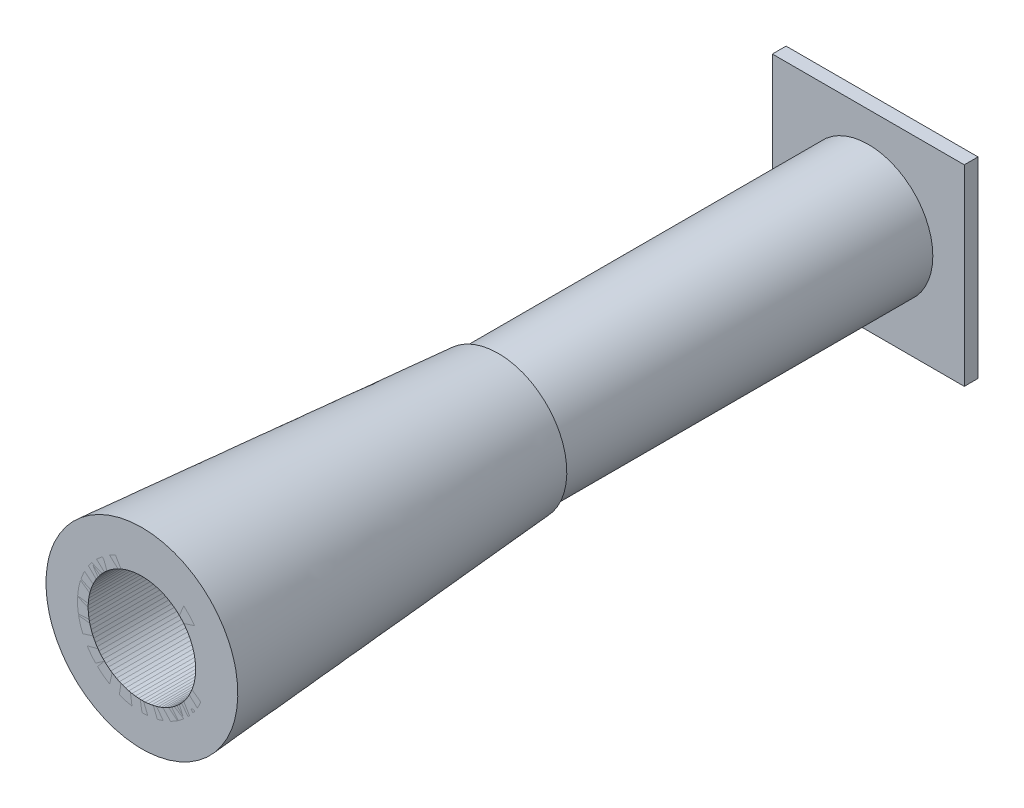
ISO-10303-21;
HEADER;
FILE_DESCRIPTION(('STEP AP214'),'2;1');
FILE_NAME('part.step','',(''),(''),'','','');
FILE_SCHEMA(('AUTOMOTIVE_DESIGN { 1 0 10303 214 1 1 1 1 }'));
ENDSEC;
DATA;
#1=APPLICATION_CONTEXT('core data for automotive mechanical design processes');
#2=APPLICATION_PROTOCOL_DEFINITION('international standard','automotive_design',2000,#1);
#3=PRODUCT_CONTEXT('',#1,'mechanical');
#4=PRODUCT('Part','Part','',(#3));
#5=PRODUCT_RELATED_PRODUCT_CATEGORY('part','',(#4));
#6=PRODUCT_DEFINITION_FORMATION('','',#4);
#7=PRODUCT_DEFINITION_CONTEXT('part definition',#1,'design');
#8=PRODUCT_DEFINITION('design','',#6,#7);
#9=PRODUCT_DEFINITION_SHAPE('','',#8);
#10=(LENGTH_UNIT() NAMED_UNIT(*) SI_UNIT(.MILLI.,.METRE.));
#11=(NAMED_UNIT(*) PLANE_ANGLE_UNIT() SI_UNIT($,.RADIAN.));
#12=(NAMED_UNIT(*) SI_UNIT($,.STERADIAN.) SOLID_ANGLE_UNIT());
#13=UNCERTAINTY_MEASURE_WITH_UNIT(LENGTH_MEASURE(1.E-05),#10,'distance_accuracy_value','');
#14=(GEOMETRIC_REPRESENTATION_CONTEXT(3) GLOBAL_UNCERTAINTY_ASSIGNED_CONTEXT((#13)) GLOBAL_UNIT_ASSIGNED_CONTEXT((#10,
#11,#12)) REPRESENTATION_CONTEXT('',''));
#15=CARTESIAN_POINT('',(0.,0.,0.));
#16=DIRECTION('',(0.,0.,1.));
#17=DIRECTION('',(1.,0.,0.));
#18=AXIS2_PLACEMENT_3D('',#15,#16,#17);
#19=CARTESIAN_POINT('',(0.,0.,6.604));
#20=DIRECTION('',(0.,0.,1.));
#21=DIRECTION('',(1.,0.,0.));
#22=AXIS2_PLACEMENT_3D('',#19,#20,#21);
#23=PLANE('',#22);
#24=CARTESIAN_POINT('',(0.,0.,6.604));
#25=DIRECTION('',(0.,0.,1.));
#26=DIRECTION('',(1.,0.,0.));
#27=AXIS2_PLACEMENT_3D('',#24,#25,#26);
#28=CIRCLE('',#27,0.99695);
#29=CARTESIAN_POINT('',(0.99695,0.,6.604));
#30=VERTEX_POINT('',#29);
#31=EDGE_CURVE('E150',#30,#30,#28,.T.);
#32=ORIENTED_EDGE('',*,*,#31,.F.);
#33=EDGE_LOOP('',(#32));
#34=FACE_BOUND('',#33,.T.);
#35=CARTESIAN_POINT('',(0.,0.,6.604));
#36=DIRECTION('',(0.,0.,1.));
#37=DIRECTION('',(1.,0.,0.));
#38=AXIS2_PLACEMENT_3D('',#35,#36,#37);
#39=CIRCLE('',#38,1.77744711569565);
#40=CARTESIAN_POINT('',(0.,1.77744711569565,6.604));
#41=VERTEX_POINT('',#40);
#42=EDGE_CURVE('E13',#41,#41,#39,.T.);
#43=ORIENTED_EDGE('',*,*,#42,.T.);
#44=EDGE_LOOP('',(#43));
#45=FACE_BOUND('',#44,.T.);
#46=ADVANCED_FACE('F75',(#34,#45),#23,.T.);
#47=CARTESIAN_POINT('',(0.,0.,0.));
#48=DIRECTION('',(0.,0.,1.));
#49=DIRECTION('',(1.,0.,0.));
#50=AXIS2_PLACEMENT_3D('',#47,#48,#49);
#51=PLANE('',#50);
#52=CARTESIAN_POINT('',(0.,0.,0.));
#53=DIRECTION('',(0.,0.,1.));
#54=DIRECTION('',(1.,0.,0.));
#55=AXIS2_PLACEMENT_3D('',#52,#53,#54);
#56=CIRCLE('',#55,1.27);
#57=CARTESIAN_POINT('',(-1.26997479373003E-11,1.27,0.));
#58=VERTEX_POINT('',#57);
#59=EDGE_CURVE('E83',#58,#58,#56,.T.);
#60=ORIENTED_EDGE('',*,*,#59,.F.);
#61=EDGE_LOOP('',(#60));
#62=FACE_BOUND('',#61,.T.);
#63=ADVANCED_FACE('F107',(#62),#51,.F.);
#64=CARTESIAN_POINT('',(-1.26997479373003E-11,1.27,0.));
#65=CARTESIAN_POINT('',(-8.46638568714059E-12,1.43914903856522,2.20133333333333));
#66=CARTESIAN_POINT('',(-4.23303021324442E-12,1.60829807713043,4.40266666666667));
#67=CARTESIAN_POINT('',(0.,1.77744711569565,6.604));
#68=CARTESIAN_POINT('',(-0.0350466031428165,1.26999999999965,0.));
#69=CARTESIAN_POINT('',(-0.0397143978034933,1.43914903856498,2.20133333333333));
#70=CARTESIAN_POINT('',(-0.0443821924641701,1.60829807713031,4.40266666666667));
#71=CARTESIAN_POINT('',(-0.0490499871248469,1.77744711569565,6.604));
#72=CARTESIAN_POINT('',(-0.104480488776998,1.26715466031197,0.));
#73=CARTESIAN_POINT('',(-0.118396059027349,1.4359247331512,2.20133333333333));
#74=CARTESIAN_POINT('',(-0.1323116292777,1.60469480599042,4.40266666666667));
#75=CARTESIAN_POINT('',(-0.14622719952805,1.77346487882965,6.604));
#76=CARTESIAN_POINT('',(-0.206325452490974,1.25467853457865,0.));
#77=CARTESIAN_POINT('',(-0.233805572107468,1.42178693444763,2.20133333333333));
#78=CARTESIAN_POINT('',(-0.261285691723963,1.58889533431662,4.40266666666667));
#79=CARTESIAN_POINT('',(-0.288765811340457,1.75600373418561,6.604));
#80=CARTESIAN_POINT('',(-0.305536648608512,1.23432219550268,0.));
#81=CARTESIAN_POINT('',(-0.346230530774854,1.39871937081826,2.20133333333333));
#82=CARTESIAN_POINT('',(-0.386924412941197,1.56311654613385,4.40266666666667));
#83=CARTESIAN_POINT('',(-0.427618295107539,1.72751372144943,6.604));
#84=CARTESIAN_POINT('',(-0.883033802580258,1.06687029814585,0.));
#85=CARTESIAN_POINT('',(-1.00064350236035,1.20896485342962,2.20133333333333));
#86=CARTESIAN_POINT('',(-1.11825320214044,1.35105940871339,4.40266666666667));
#87=CARTESIAN_POINT('',(-1.23586290192053,1.49315396399715,6.604));
#88=CARTESIAN_POINT('',(-1.27000000000561,0.56074565006917,0.));
#89=CARTESIAN_POINT('',(-1.43914903856895,0.635430364711966,2.20133333333333));
#90=CARTESIAN_POINT('',(-1.6082980771323,0.710115079354762,4.40266666666667));
#91=CARTESIAN_POINT('',(-1.77744711569565,0.784799793997559,6.604));
#92=CARTESIAN_POINT('',(-1.26999999999299,-0.700932062615037,0.));
#93=CARTESIAN_POINT('',(-1.43914903856054,-0.794287955909007,2.20133333333333));
#94=CARTESIAN_POINT('',(-1.60829807712809,-0.887643849202978,4.40266666666667));
#95=CARTESIAN_POINT('',(-1.77744711569565,-0.980999742496948,6.604));
#96=CARTESIAN_POINT('',(-0.700932062589637,-1.27000000000701,0.));
#97=CARTESIAN_POINT('',(-0.794287955892074,-1.43914903856989,2.20133333333333));
#98=CARTESIAN_POINT('',(-0.887643849194511,-1.60829807713277,4.40266666666667));
#99=CARTESIAN_POINT('',(-0.980999742496949,-1.77744711569565,6.604));
#100=CARTESIAN_POINT('',(0.700932062615037,-1.26999999999299,0.));
#101=CARTESIAN_POINT('',(0.794287955909007,-1.43914903856054,2.20133333333333));
#102=CARTESIAN_POINT('',(0.887643849202978,-1.60829807712809,4.40266666666667));
#103=CARTESIAN_POINT('',(0.980999742496948,-1.77744711569565,6.604));
#104=CARTESIAN_POINT('',(1.27000000000701,-0.700932062589637,0.));
#105=CARTESIAN_POINT('',(1.43914903856989,-0.794287955892075,2.20133333333333));
#106=CARTESIAN_POINT('',(1.60829807713277,-0.887643849194512,4.40266666666667));
#107=CARTESIAN_POINT('',(1.77744711569565,-0.980999742496949,6.604));
#108=CARTESIAN_POINT('',(1.26999999999439,0.560745650094569,0.));
#109=CARTESIAN_POINT('',(1.43914903856148,0.635430364728899,2.20133333333333));
#110=CARTESIAN_POINT('',(1.60829807712856,0.710115079363229,4.40266666666667));
#111=CARTESIAN_POINT('',(1.77744711569565,0.784799793997558,6.604));
#112=CARTESIAN_POINT('',(0.883033802558921,1.06687029816351,0.));
#113=CARTESIAN_POINT('',(1.00064350234612,1.20896485344139,2.20133333333333));
#114=CARTESIAN_POINT('',(1.11825320213333,1.35105940871927,4.40266666666667));
#115=CARTESIAN_POINT('',(1.23586290192053,1.49315396399715,6.604));
#116=CARTESIAN_POINT('',(0.305536648583826,1.23432219550879,0.));
#117=CARTESIAN_POINT('',(0.346230530758397,1.39871937082233,2.20133333333333));
#118=CARTESIAN_POINT('',(0.386924412932968,1.56311654613588,4.40266666666667));
#119=CARTESIAN_POINT('',(0.42761829510754,1.72751372144943,6.604));
#120=CARTESIAN_POINT('',(0.206325452465881,1.25467853458277,0.));
#121=CARTESIAN_POINT('',(0.23380557209074,1.42178693445038,2.20133333333333));
#122=CARTESIAN_POINT('',(0.261285691715599,1.588895334318,4.40266666666667));
#123=CARTESIAN_POINT('',(0.288765811340458,1.75600373418561,6.604));
#124=CARTESIAN_POINT('',(0.104480488751656,1.26715466031406,0.));
#125=CARTESIAN_POINT('',(0.118396059010454,1.43592473315259,2.20133333333333));
#126=CARTESIAN_POINT('',(0.132311629269253,1.60469480599112,4.40266666666667));
#127=CARTESIAN_POINT('',(0.146227199528051,1.77346487882965,6.604));
#128=CARTESIAN_POINT('',(0.035046603117417,1.27000000000035,0.));
#129=CARTESIAN_POINT('',(0.0397143977865605,1.43914903856545,2.20133333333333));
#130=CARTESIAN_POINT('',(0.0443821924557041,1.60829807713055,4.40266666666667));
#131=CARTESIAN_POINT('',(0.0490499871248476,1.77744711569565,6.604));
#132=CARTESIAN_POINT('',(-1.26997479373003E-11,1.27,0.));
#133=CARTESIAN_POINT('',(-8.46638568714059E-12,1.43914903856522,2.20133333333333));
#134=CARTESIAN_POINT('',(-4.23303021324442E-12,1.60829807713043,4.40266666666667));
#135=CARTESIAN_POINT('',(0.,1.77744711569565,6.604));
#136=B_SPLINE_SURFACE_WITH_KNOTS('',3,3,((#64,#65,#66,#67),(#68,#69,#70,#71),(#72,#73,#74,#75),
(#76,#77,#78,#79),(#80,#81,#82,#83),(#84,#85,#86,#87),(#88,#89,#90,#91),(#92,#93,#94,#95),(#96,
#97,#98,#99),(#100,#101,#102,#103),(#104,#105,#106,#107),(#108,#109,#110,#111),(#112,#113,#114,
#115),(#116,#117,#118,#119),(#120,#121,#122,#123),(#124,#125,#126,#127),(#128,#129,#130,#131),
(#132,#133,#134,#135)),.UNSPECIFIED.,.T.,.F.,.F.,(4,1,1,1,1,2,2,2,1,1,1,1,4),(4,4),(0.,0.0125,
0.0249999999999999,0.0375000000000001,0.05,0.25,0.5,0.75,0.95,0.9625,0.975,0.9875,1.),(0.,1.),.UNSPECIFIED.);
#137=CARTESIAN_POINT('',(-1.26997479373003E-11,1.27,0.));
#138=CARTESIAN_POINT('',(-1.25674553669828E-11,1.27528590745516,0.0687916666666665));
#139=CARTESIAN_POINT('',(-1.24351628032828E-11,1.28057181491033,0.137583333333333));
#140=CARTESIAN_POINT('',(-1.21705776884972E-11,1.29114362982065,0.275166666666667));
#141=CARTESIAN_POINT('',(-1.20382851374117E-11,1.29642953727581,0.343958333333333));
#142=CARTESIAN_POINT('',(-1.17737000472347E-11,1.30700135218614,0.481541666666667));
#143=CARTESIAN_POINT('',(-1.16414075081433E-11,1.3122872596413,0.550333333333333));
#144=CARTESIAN_POINT('',(-1.13768224413342E-11,1.32285907455163,0.687916666666667));
#145=CARTESIAN_POINT('',(-1.12445299136165E-11,1.32814498200679,0.756708333333333));
#146=CARTESIAN_POINT('',(-1.09799448689344E-11,1.33871679691712,0.894291666666667));
#147=CARTESIAN_POINT('',(-1.08476523519701E-11,1.34400270437228,0.963083333333333));
#148=CARTESIAN_POINT('',(-1.05830673281744E-11,1.35457451928261,1.10066666666667));
#149=CARTESIAN_POINT('',(-1.0450774821343E-11,1.35986042673777,1.16945833333333));
#150=CARTESIAN_POINT('',(-1.01861898171928E-11,1.3704322416481,1.30704166666667));
#151=CARTESIAN_POINT('',(-1.0053897319874E-11,1.37571814910326,1.37583333333333));
#152=CARTESIAN_POINT('',(-9.78931233412859E-12,1.38628996401359,1.51341666666667));
#153=CARTESIAN_POINT('',(-9.65701984570198E-12,1.39157587146875,1.58220833333333));
#154=CARTESIAN_POINT('',(-9.39243487712056E-12,1.40214768637907,1.71979166666667));
#155=CARTESIAN_POINT('',(-9.26014239696575E-12,1.40743359383424,1.78858333333333));
#156=CARTESIAN_POINT('',(-8.99555744430756E-12,1.41800540874456,1.92616666666667));
#157=CARTESIAN_POINT('',(-8.86326497180418E-12,1.42329131619973,1.99495833333333));
#158=CARTESIAN_POINT('',(-8.59868003382844E-12,1.43386313111005,2.13254166666667));
#159=CARTESIAN_POINT('',(-8.4663875683561E-12,1.43914903856522,2.20133333333333));
#160=CARTESIAN_POINT('',(-8.20180264382205E-12,1.44972085347554,2.33891666666667));
#161=CARTESIAN_POINT('',(-8.06951018476035E-12,1.4550067609307,2.40770833333333));
#162=CARTESIAN_POINT('',(-7.80492527242721E-12,1.46557857584103,2.54529166666667));
#163=CARTESIAN_POINT('',(-7.67263281915578E-12,1.47086448329619,2.61408333333333));
#164=CARTESIAN_POINT('',(-7.40804791778278E-12,1.48143629820652,2.75166666666667));
#165=CARTESIAN_POINT('',(-7.27575546968123E-12,1.48672220566168,2.82045833333333));
#166=CARTESIAN_POINT('',(-7.01117057802761E-12,1.49729402057201,2.95804166666667));
#167=CARTESIAN_POINT('',(-6.87887813447555E-12,1.50257992802717,3.02683333333333));
#168=CARTESIAN_POINT('',(-6.61429325130053E-12,1.5131517429375,3.16441666666667));
#169=CARTESIAN_POINT('',(-6.48200081167757E-12,1.51843765039266,3.23320833333333));
#170=CARTESIAN_POINT('',(-6.21741593574038E-12,1.52900946530299,3.37079166666667));
#171=CARTESIAN_POINT('',(-6.08512349942615E-12,1.53429537275815,3.43958333333333));
#172=CARTESIAN_POINT('',(-5.82053862948602E-12,1.54486718766847,3.57716666666667));
#173=CARTESIAN_POINT('',(-5.68824619586013E-12,1.55015309512364,3.64595833333333));
#174=CARTESIAN_POINT('',(-5.42366133067629E-12,1.56072491003396,3.78354166666667));
#175=CARTESIAN_POINT('',(-5.29136889911834E-12,1.56601081748913,3.85233333333333));
#176=CARTESIAN_POINT('',(-5.02678403745002E-12,1.57658263239945,3.98991666666667));
#177=CARTESIAN_POINT('',(-4.89449160733964E-12,1.58186853985462,4.05870833333333));
#178=CARTESIAN_POINT('',(-4.62990674794607E-12,1.59244035476494,4.19629166666667));
#179=CARTESIAN_POINT('',(-4.49761431866287E-12,1.59772626222011,4.26508333333333));
#180=CARTESIAN_POINT('',(-4.23302946030327E-12,1.60829807713043,4.40266666666667));
#181=CARTESIAN_POINT('',(-4.10073703122687E-12,1.61358398458559,4.47145833333333));
#182=CARTESIAN_POINT('',(-3.83615217266047E-12,1.62415579949592,4.60904166666667));
#183=CARTESIAN_POINT('',(-3.70385974317048E-12,1.62944170695108,4.67783333333333));
#184=CARTESIAN_POINT('',(-3.43927488315652E-12,1.64001352186141,4.81541666666667));
#185=CARTESIAN_POINT('',(-3.30698245263255E-12,1.64529942931657,4.88420833333333));
#186=CARTESIAN_POINT('',(-3.04239758993025E-12,1.6558712442269,5.02179166666667));
#187=CARTESIAN_POINT('',(-2.91010515775192E-12,1.66115715168206,5.09058333333333));
#188=CARTESIAN_POINT('',(-2.64552029112051E-12,1.67172896659239,5.22816666666667));
#189=CARTESIAN_POINT('',(-2.51322785666744E-12,1.67701487404755,5.29695833333333));
#190=CARTESIAN_POINT('',(-2.24864298486615E-12,1.68758668895788,5.43454166666667));
#191=CARTESIAN_POINT('',(-2.11635054751794E-12,1.69287259641304,5.50333333333333));
#192=CARTESIAN_POINT('',(-1.85176566930601E-12,1.70344441132337,5.64091666666667));
#193=CARTESIAN_POINT('',(-1.71947322844228E-12,1.70873031877853,5.70970833333333));
#194=CARTESIAN_POINT('',(-1.45488834257893E-12,1.71930213368885,5.84729166666667));
#195=CARTESIAN_POINT('',(-1.3225958975793E-12,1.72458804114402,5.91608333333333));
#196=CARTESIAN_POINT('',(-1.05801100282375E-12,1.73515985605434,6.05366666666667));
#197=CARTESIAN_POINT('',(-9.25718553067834E-13,1.74044576350951,6.12245833333333));
#198=CARTESIAN_POINT('',(-6.61133648179325E-13,1.75101757841983,6.26004166666667));
#199=CARTESIAN_POINT('',(-5.28841193046733E-13,1.75630348587499,6.32883333333333));
#200=CARTESIAN_POINT('',(-2.6425627678449E-13,1.76687530078532,6.46641666666667));
#201=CARTESIAN_POINT('',(-1.31963815654839E-13,1.77216120824048,6.53520833333333));
#202=CARTESIAN_POINT('',(0.,1.77744711569565,6.604));
#203=B_SPLINE_CURVE_WITH_KNOTS('',3,(#137,#138,#139,#140,#141,#142,#143,#144,#145,#146,#147,
#148,#149,#150,#151,#152,#153,#154,#155,#156,#157,#158,#159,#160,#161,#162,#163,#164,#165,#166,
#167,#168,#169,#170,#171,#172,#173,#174,#175,#176,#177,#178,#179,#180,#181,#182,#183,#184,#185,
#186,#187,#188,#189,#190,#191,#192,#193,#194,#195,#196,#197,#198,#199,#200,#201,#202),
.UNSPECIFIED.,.F.,.F.,(4,2,2,2,2,2,2,2,2,2,2,2,2,2,2,2,2,2,2,2,2,2,2,2,2,2,2,2,2,2,2,2,4),(0.,
0.206983351947979,0.413966703895958,0.620950055843937,0.827933407791916,1.03491675973989,
1.24190011168787,1.44888346363585,1.65586681558383,1.86285016753181,2.06983351947979,
2.27681687142777,2.48380022337575,2.69078357532373,2.89776692727171,3.10475027921969,
3.31173363116766,3.51871698311564,3.72570033506362,3.9326836870116,4.13966703895958,
4.34665039090756,4.55363374285554,4.76061709480352,4.96760044675149,5.17458379869947,
5.38156715064745,5.58855050259543,5.79553385454341,6.00251720649139,6.20950055843937,
6.41648391038734,6.62346726233532),.UNSPECIFIED.);
#204=EDGE_CURVE('BSEAM116',#58,#41,#203,.T.);
#205=ORIENTED_EDGE('',*,*,#59,.T.);
#206=ORIENTED_EDGE('',*,*,#42,.F.);
#207=ORIENTED_EDGE('',*,*,#204,.T.);
#208=ORIENTED_EDGE('',*,*,#204,.F.);
#209=EDGE_LOOP('',(#205,#207,#206,#208));
#210=FACE_BOUND('',#209,.T.);
#211=ADVANCED_FACE('F116',(#210),#136,.T.);
#212=CARTESIAN_POINT('',(0.,0.,0.508));
#213=DIRECTION('',(0.,0.,1.));
#214=DIRECTION('',(1.,0.,0.));
#215=AXIS2_PLACEMENT_3D('',#212,#213,#214);
#216=CYLINDRICAL_SURFACE('',#215,0.99695);
#217=CARTESIAN_POINT('',(0.,0.,0.508));
#218=DIRECTION('',(0.,0.,1.));
#219=DIRECTION('',(1.,0.,0.));
#220=AXIS2_PLACEMENT_3D('',#217,#218,#219);
#221=CIRCLE('',#220,0.99695);
#222=CARTESIAN_POINT('',(0.99695,0.,0.508));
#223=VERTEX_POINT('',#222);
#224=EDGE_CURVE('E88',#223,#223,#221,.T.);
#225=CARTESIAN_POINT('',(0.99695,0.,0.508));
#226=CARTESIAN_POINT('',(0.99695,0.,0.5715));
#227=CARTESIAN_POINT('',(0.99695,0.,0.635));
#228=CARTESIAN_POINT('',(0.99695,0.,0.762));
#229=CARTESIAN_POINT('',(0.99695,0.,0.8255));
#230=CARTESIAN_POINT('',(0.99695,0.,0.9525));
#231=CARTESIAN_POINT('',(0.99695,0.,1.016));
#232=CARTESIAN_POINT('',(0.99695,0.,1.143));
#233=CARTESIAN_POINT('',(0.99695,0.,1.2065));
#234=CARTESIAN_POINT('',(0.99695,0.,1.3335));
#235=CARTESIAN_POINT('',(0.99695,0.,1.397));
#236=CARTESIAN_POINT('',(0.99695,0.,1.524));
#237=CARTESIAN_POINT('',(0.99695,0.,1.5875));
#238=CARTESIAN_POINT('',(0.99695,0.,1.7145));
#239=CARTESIAN_POINT('',(0.99695,0.,1.778));
#240=CARTESIAN_POINT('',(0.99695,0.,1.905));
#241=CARTESIAN_POINT('',(0.99695,0.,1.9685));
#242=CARTESIAN_POINT('',(0.99695,0.,2.0955));
#243=CARTESIAN_POINT('',(0.99695,0.,2.159));
#244=CARTESIAN_POINT('',(0.99695,0.,2.286));
#245=CARTESIAN_POINT('',(0.99695,0.,2.3495));
#246=CARTESIAN_POINT('',(0.99695,0.,2.4765));
#247=CARTESIAN_POINT('',(0.99695,0.,2.54));
#248=CARTESIAN_POINT('',(0.99695,0.,2.667));
#249=CARTESIAN_POINT('',(0.99695,0.,2.7305));
#250=CARTESIAN_POINT('',(0.99695,0.,2.8575));
#251=CARTESIAN_POINT('',(0.99695,0.,2.921));
#252=CARTESIAN_POINT('',(0.99695,0.,3.048));
#253=CARTESIAN_POINT('',(0.99695,0.,3.1115));
#254=CARTESIAN_POINT('',(0.99695,0.,3.2385));
#255=CARTESIAN_POINT('',(0.99695,0.,3.302));
#256=CARTESIAN_POINT('',(0.99695,0.,3.429));
#257=CARTESIAN_POINT('',(0.99695,0.,3.4925));
#258=CARTESIAN_POINT('',(0.99695,0.,3.6195));
#259=CARTESIAN_POINT('',(0.99695,0.,3.683));
#260=CARTESIAN_POINT('',(0.99695,0.,3.81));
#261=CARTESIAN_POINT('',(0.99695,0.,3.8735));
#262=CARTESIAN_POINT('',(0.99695,0.,4.0005));
#263=CARTESIAN_POINT('',(0.99695,0.,4.064));
#264=CARTESIAN_POINT('',(0.99695,0.,4.191));
#265=CARTESIAN_POINT('',(0.99695,0.,4.2545));
#266=CARTESIAN_POINT('',(0.99695,0.,4.3815));
#267=CARTESIAN_POINT('',(0.99695,0.,4.445));
#268=CARTESIAN_POINT('',(0.99695,0.,4.572));
#269=CARTESIAN_POINT('',(0.99695,0.,4.6355));
#270=CARTESIAN_POINT('',(0.99695,0.,4.7625));
#271=CARTESIAN_POINT('',(0.99695,0.,4.826));
#272=CARTESIAN_POINT('',(0.99695,0.,4.953));
#273=CARTESIAN_POINT('',(0.99695,0.,5.0165));
#274=CARTESIAN_POINT('',(0.99695,0.,5.1435));
#275=CARTESIAN_POINT('',(0.99695,0.,5.207));
#276=CARTESIAN_POINT('',(0.99695,0.,5.334));
#277=CARTESIAN_POINT('',(0.99695,0.,5.3975));
#278=CARTESIAN_POINT('',(0.99695,0.,5.5245));
#279=CARTESIAN_POINT('',(0.99695,0.,5.588));
#280=CARTESIAN_POINT('',(0.99695,0.,5.715));
#281=CARTESIAN_POINT('',(0.99695,0.,5.7785));
#282=CARTESIAN_POINT('',(0.99695,0.,5.9055));
#283=CARTESIAN_POINT('',(0.99695,0.,5.969));
#284=CARTESIAN_POINT('',(0.99695,0.,6.096));
#285=CARTESIAN_POINT('',(0.99695,0.,6.1595));
#286=CARTESIAN_POINT('',(0.99695,0.,6.2865));
#287=CARTESIAN_POINT('',(0.99695,0.,6.35));
#288=CARTESIAN_POINT('',(0.99695,0.,6.477));
#289=CARTESIAN_POINT('',(0.99695,0.,6.5405));
#290=CARTESIAN_POINT('',(0.99695,0.,6.604));
#291=B_SPLINE_CURVE_WITH_KNOTS('',3,(#225,#226,#227,#228,#229,#230,#231,#232,#233,#234,#235,
#236,#237,#238,#239,#240,#241,#242,#243,#244,#245,#246,#247,#248,#249,#250,#251,#252,#253,#254,
#255,#256,#257,#258,#259,#260,#261,#262,#263,#264,#265,#266,#267,#268,#269,#270,#271,#272,#273,
#274,#275,#276,#277,#278,#279,#280,#281,#282,#283,#284,#285,#286,#287,#288,#289,#290),
.UNSPECIFIED.,.F.,.F.,(4,2,2,2,2,2,2,2,2,2,2,2,2,2,2,2,2,2,2,2,2,2,2,2,2,2,2,2,2,2,2,2,4),(0.,
0.1905,0.381,0.5715,0.762,0.9525,1.143,1.3335,1.524,1.7145,1.905,2.0955,2.286,2.4765,2.667,
2.8575,3.048,3.2385,3.429,3.6195,3.81,4.0005,4.191,4.3815,4.572,4.7625,4.953,5.1435,5.334,
5.5245,5.715,5.9055,6.096),.UNSPECIFIED.);
#292=EDGE_CURVE('BSEAM118',#223,#30,#291,.T.);
#293=ORIENTED_EDGE('',*,*,#224,.F.);
#294=ORIENTED_EDGE('',*,*,#31,.T.);
#295=ORIENTED_EDGE('',*,*,#292,.T.);
#296=ORIENTED_EDGE('',*,*,#292,.F.);
#297=EDGE_LOOP('',(#293,#295,#294,#296));
#298=FACE_BOUND('',#297,.T.);
#299=ADVANCED_FACE('F118',(#298),#216,.F.);
#300=CARTESIAN_POINT('',(0.,0.,0.508));
#301=DIRECTION('',(0.,0.,1.));
#302=DIRECTION('',(1.,0.,0.));
#303=AXIS2_PLACEMENT_3D('',#300,#301,#302);
#304=PLANE('',#303);
#305=ORIENTED_EDGE('',*,*,#224,.T.);
#306=EDGE_LOOP('',(#305));
#307=FACE_BOUND('',#306,.T.);
#308=ADVANCED_FACE('F156',(#307),#304,.T.);
#309=CLOSED_SHELL('',(#46,#63,#211,#299,#308));
#310=MANIFOLD_SOLID_BREP('B2',#309);
#311=CARTESIAN_POINT('',(0.,0.,-6.858));
#312=DIRECTION('',(0.,0.,1.));
#313=DIRECTION('',(1.,0.,0.));
#314=AXIS2_PLACEMENT_3D('',#311,#312,#313);
#315=CYLINDRICAL_SURFACE('',#314,1.1938);
#316=CARTESIAN_POINT('',(0.,0.,-6.858));
#317=DIRECTION('',(0.,0.,-1.));
#318=DIRECTION('',(-1.,0.,0.));
#319=AXIS2_PLACEMENT_3D('',#316,#317,#318);
#320=CIRCLE('',#319,1.1938);
#321=CARTESIAN_POINT('',(-1.1938,0.,-6.858));
#322=VERTEX_POINT('',#321);
#323=EDGE_CURVE('E273',#322,#322,#320,.F.);
#324=ORIENTED_EDGE('',*,*,#323,.T.);
#325=EDGE_LOOP('',(#324));
#326=FACE_BOUND('',#325,.T.);
#327=CARTESIAN_POINT('',(0.,0.,6.604));
#328=DIRECTION('',(0.,0.,1.));
#329=DIRECTION('',(1.,0.,0.));
#330=AXIS2_PLACEMENT_3D('',#327,#328,#329);
#331=CIRCLE('',#330,1.1938);
#332=CARTESIAN_POINT('',(1.1938,0.,6.604));
#333=VERTEX_POINT('',#332);
#334=EDGE_CURVE('E205',#333,#333,#331,.T.);
#335=ORIENTED_EDGE('',*,*,#334,.F.);
#336=EDGE_LOOP('',(#335));
#337=FACE_BOUND('',#336,.T.);
#338=ADVANCED_FACE('F197',(#326,#337),#315,.T.);
#339=CARTESIAN_POINT('',(0.,0.,6.604));
#340=DIRECTION('',(0.,0.,1.));
#341=DIRECTION('',(1.,0.,0.));
#342=AXIS2_PLACEMENT_3D('',#339,#340,#341);
#343=PLANE('',#342);
#344=ORIENTED_EDGE('',*,*,#334,.T.);
#345=EDGE_LOOP('',(#344));
#346=FACE_BOUND('',#345,.T.);
#347=CARTESIAN_POINT('',(0.,0.,6.604));
#348=DIRECTION('',(0.,0.,1.));
#349=DIRECTION('',(1.,0.,0.));
#350=AXIS2_PLACEMENT_3D('',#347,#348,#349);
#351=CIRCLE('',#350,0.99695);
#352=CARTESIAN_POINT('',(-0.99695,0.,6.604));
#353=VERTEX_POINT('',#352);
#354=EDGE_CURVE('E276',#353,#353,#351,.T.);
#355=ORIENTED_EDGE('',*,*,#354,.F.);
#356=EDGE_LOOP('',(#355));
#357=FACE_BOUND('',#356,.T.);
#358=ADVANCED_FACE('F281',(#346,#357),#343,.T.);
#359=CARTESIAN_POINT('',(0.,0.,6.604));
#360=DIRECTION('',(0.,0.,-1.));
#361=DIRECTION('',(-1.,0.,0.));
#362=AXIS2_PLACEMENT_3D('',#359,#360,#361);
#363=CYLINDRICAL_SURFACE('',#362,0.99695);
#364=CARTESIAN_POINT('',(0.,0.,0.));
#365=DIRECTION('',(0.,0.,1.));
#366=DIRECTION('',(1.,0.,0.));
#367=AXIS2_PLACEMENT_3D('',#364,#365,#366);
#368=CIRCLE('',#367,0.99695);
#369=CARTESIAN_POINT('',(-0.99695,0.,0.));
#370=VERTEX_POINT('',#369);
#371=EDGE_CURVE('E73',#370,#370,#368,.F.);
#372=CARTESIAN_POINT('',(-0.99695,0.,6.604));
#373=CARTESIAN_POINT('',(-0.99695,0.,6.53520833333333));
#374=CARTESIAN_POINT('',(-0.99695,0.,6.46641666666667));
#375=CARTESIAN_POINT('',(-0.99695,0.,6.32883333333333));
#376=CARTESIAN_POINT('',(-0.99695,0.,6.26004166666667));
#377=CARTESIAN_POINT('',(-0.99695,0.,6.12245833333333));
#378=CARTESIAN_POINT('',(-0.99695,0.,6.05366666666667));
#379=CARTESIAN_POINT('',(-0.99695,0.,5.91608333333333));
#380=CARTESIAN_POINT('',(-0.99695,0.,5.84729166666667));
#381=CARTESIAN_POINT('',(-0.99695,0.,5.70970833333333));
#382=CARTESIAN_POINT('',(-0.99695,0.,5.64091666666667));
#383=CARTESIAN_POINT('',(-0.99695,0.,5.50333333333333));
#384=CARTESIAN_POINT('',(-0.99695,0.,5.43454166666667));
#385=CARTESIAN_POINT('',(-0.99695,0.,5.29695833333333));
#386=CARTESIAN_POINT('',(-0.99695,0.,5.22816666666667));
#387=CARTESIAN_POINT('',(-0.99695,0.,5.09058333333333));
#388=CARTESIAN_POINT('',(-0.99695,0.,5.02179166666667));
#389=CARTESIAN_POINT('',(-0.99695,0.,4.88420833333333));
#390=CARTESIAN_POINT('',(-0.99695,0.,4.81541666666667));
#391=CARTESIAN_POINT('',(-0.99695,0.,4.67783333333333));
#392=CARTESIAN_POINT('',(-0.99695,0.,4.60904166666667));
#393=CARTESIAN_POINT('',(-0.99695,0.,4.47145833333333));
#394=CARTESIAN_POINT('',(-0.99695,0.,4.40266666666667));
#395=CARTESIAN_POINT('',(-0.99695,0.,4.26508333333333));
#396=CARTESIAN_POINT('',(-0.99695,0.,4.19629166666667));
#397=CARTESIAN_POINT('',(-0.99695,0.,4.05870833333333));
#398=CARTESIAN_POINT('',(-0.99695,0.,3.98991666666667));
#399=CARTESIAN_POINT('',(-0.99695,0.,3.85233333333333));
#400=CARTESIAN_POINT('',(-0.99695,0.,3.78354166666667));
#401=CARTESIAN_POINT('',(-0.99695,0.,3.64595833333333));
#402=CARTESIAN_POINT('',(-0.99695,0.,3.57716666666667));
#403=CARTESIAN_POINT('',(-0.99695,0.,3.43958333333333));
#404=CARTESIAN_POINT('',(-0.99695,0.,3.37079166666667));
#405=CARTESIAN_POINT('',(-0.99695,0.,3.23320833333333));
#406=CARTESIAN_POINT('',(-0.99695,0.,3.16441666666667));
#407=CARTESIAN_POINT('',(-0.99695,0.,3.02683333333333));
#408=CARTESIAN_POINT('',(-0.99695,0.,2.95804166666667));
#409=CARTESIAN_POINT('',(-0.99695,0.,2.82045833333333));
#410=CARTESIAN_POINT('',(-0.99695,0.,2.75166666666667));
#411=CARTESIAN_POINT('',(-0.99695,0.,2.61408333333333));
#412=CARTESIAN_POINT('',(-0.99695,0.,2.54529166666667));
#413=CARTESIAN_POINT('',(-0.99695,0.,2.40770833333333));
#414=CARTESIAN_POINT('',(-0.99695,0.,2.33891666666667));
#415=CARTESIAN_POINT('',(-0.99695,0.,2.20133333333333));
#416=CARTESIAN_POINT('',(-0.99695,0.,2.13254166666667));
#417=CARTESIAN_POINT('',(-0.99695,0.,1.99495833333333));
#418=CARTESIAN_POINT('',(-0.99695,0.,1.92616666666667));
#419=CARTESIAN_POINT('',(-0.99695,0.,1.78858333333333));
#420=CARTESIAN_POINT('',(-0.99695,0.,1.71979166666667));
#421=CARTESIAN_POINT('',(-0.99695,0.,1.58220833333333));
#422=CARTESIAN_POINT('',(-0.99695,0.,1.51341666666667));
#423=CARTESIAN_POINT('',(-0.99695,0.,1.37583333333333));
#424=CARTESIAN_POINT('',(-0.99695,0.,1.30704166666667));
#425=CARTESIAN_POINT('',(-0.99695,0.,1.16945833333333));
#426=CARTESIAN_POINT('',(-0.99695,0.,1.10066666666667));
#427=CARTESIAN_POINT('',(-0.99695,0.,0.963083333333333));
#428=CARTESIAN_POINT('',(-0.99695,0.,0.894291666666666));
#429=CARTESIAN_POINT('',(-0.99695,0.,0.756708333333333));
#430=CARTESIAN_POINT('',(-0.99695,0.,0.687916666666667));
#431=CARTESIAN_POINT('',(-0.99695,0.,0.550333333333333));
#432=CARTESIAN_POINT('',(-0.99695,0.,0.481541666666667));
#433=CARTESIAN_POINT('',(-0.99695,0.,0.343958333333333));
#434=CARTESIAN_POINT('',(-0.99695,0.,0.275166666666667));
#435=CARTESIAN_POINT('',(-0.99695,0.,0.137583333333333));
#436=CARTESIAN_POINT('',(-0.99695,0.,0.0687916666666666));
#437=CARTESIAN_POINT('',(-0.99695,0.,0.));
#438=B_SPLINE_CURVE_WITH_KNOTS('',3,(#372,#373,#374,#375,#376,#377,#378,#379,#380,#381,#382,
#383,#384,#385,#386,#387,#388,#389,#390,#391,#392,#393,#394,#395,#396,#397,#398,#399,#400,#401,
#402,#403,#404,#405,#406,#407,#408,#409,#410,#411,#412,#413,#414,#415,#416,#417,#418,#419,#420,
#421,#422,#423,#424,#425,#426,#427,#428,#429,#430,#431,#432,#433,#434,#435,#436,#437),
.UNSPECIFIED.,.F.,.F.,(4,2,2,2,2,2,2,2,2,2,2,2,2,2,2,2,2,2,2,2,2,2,2,2,2,2,2,2,2,2,2,2,4),(0.,
0.206375000000001,0.412750000000001,0.619125000000001,0.825500000000001,1.031875,1.23825,
1.444625,1.651,1.857375,2.06375,2.270125,2.4765,2.682875,2.88925,3.095625,3.302,3.508375,
3.71475,3.921125,4.1275,4.333875,4.54025,4.746625,4.953,5.159375,5.36575,5.572125,5.7785,
5.984875,6.19125,6.397625,6.604),.UNSPECIFIED.);
#439=EDGE_CURVE('BSEAM289',#353,#370,#438,.T.);
#440=ORIENTED_EDGE('',*,*,#354,.T.);
#441=ORIENTED_EDGE('',*,*,#371,.T.);
#442=ORIENTED_EDGE('',*,*,#439,.T.);
#443=ORIENTED_EDGE('',*,*,#439,.F.);
#444=EDGE_LOOP('',(#440,#442,#441,#443));
#445=FACE_BOUND('',#444,.T.);
#446=ADVANCED_FACE('F289',(#445),#363,.F.);
#447=CARTESIAN_POINT('',(0.,0.,0.));
#448=DIRECTION('',(0.,0.,1.));
#449=DIRECTION('',(1.,0.,0.));
#450=AXIS2_PLACEMENT_3D('',#447,#448,#449);
#451=PLANE('',#450);
#452=ORIENTED_EDGE('',*,*,#371,.F.);
#453=EDGE_LOOP('',(#452));
#454=FACE_BOUND('',#453,.T.);
#455=ADVANCED_FACE('F314',(#454),#451,.T.);
#456=CARTESIAN_POINT('',(1.77691822198524,1.75466201755084,-7.112));
#457=DIRECTION('',(-1.,0.,0.));
#458=DIRECTION('',(0.,-1.,0.));
#459=AXIS2_PLACEMENT_3D('',#456,#457,#458);
#460=PLANE('',#459);
#461=DIRECTION('',(0.,-1.,0.));
#462=VECTOR('',#461,1.);
#463=CARTESIAN_POINT('',(1.77691822198524,1.75466201755084,-6.858));
#464=LINE('',#463,#462);
#465=CARTESIAN_POINT('',(1.77691822198524,1.75466201755084,-6.858));
#466=VERTEX_POINT('',#465);
#467=CARTESIAN_POINT('',(1.77691822198524,-1.80133798244916,-6.858));
#468=VERTEX_POINT('',#467);
#469=EDGE_CURVE('E264',#466,#468,#464,.T.);
#470=ORIENTED_EDGE('',*,*,#469,.T.);
#471=DIRECTION('',(0.,0.,1.));
#472=VECTOR('',#471,1.);
#473=CARTESIAN_POINT('',(1.77691822198524,-1.80133798244916,-7.112));
#474=LINE('',#473,#472);
#475=CARTESIAN_POINT('',(1.77691822198524,-1.80133798244916,-7.112));
#476=VERTEX_POINT('',#475);
#477=EDGE_CURVE('E255',#476,#468,#474,.T.);
#478=ORIENTED_EDGE('',*,*,#477,.F.);
#479=DIRECTION('',(0.,-1.,0.));
#480=VECTOR('',#479,1.);
#481=CARTESIAN_POINT('',(1.77691822198524,1.75466201755084,-7.112));
#482=LINE('',#481,#480);
#483=CARTESIAN_POINT('',(1.77691822198524,1.75466201755084,-7.112));
#484=VERTEX_POINT('',#483);
#485=EDGE_CURVE('E249',#484,#476,#482,.T.);
#486=ORIENTED_EDGE('',*,*,#485,.F.);
#487=DIRECTION('',(0.,0.,1.));
#488=VECTOR('',#487,1.);
#489=CARTESIAN_POINT('',(1.77691822198524,1.75466201755084,-7.112));
#490=LINE('',#489,#488);
#491=EDGE_CURVE('E260',#484,#466,#490,.T.);
#492=ORIENTED_EDGE('',*,*,#491,.T.);
#493=EDGE_LOOP('',(#470,#478,#486,#492));
#494=FACE_BOUND('',#493,.T.);
#495=ADVANCED_FACE('F299',(#494),#460,.F.);
#496=CARTESIAN_POINT('',(1.77691822198524,-1.80133798244916,-7.112));
#497=DIRECTION('',(0.,1.,0.));
#498=DIRECTION('',(0.,0.,1.));
#499=AXIS2_PLACEMENT_3D('',#496,#497,#498);
#500=PLANE('',#499);
#501=DIRECTION('',(-1.,0.,0.));
#502=VECTOR('',#501,1.);
#503=CARTESIAN_POINT('',(1.77691822198524,-1.80133798244916,-6.858));
#504=LINE('',#503,#502);
#505=CARTESIAN_POINT('',(-1.77908177801476,-1.80133798244916,-6.858));
#506=VERTEX_POINT('',#505);
#507=EDGE_CURVE('E254',#468,#506,#504,.T.);
#508=ORIENTED_EDGE('',*,*,#507,.T.);
#509=DIRECTION('',(0.,0.,1.));
#510=VECTOR('',#509,1.);
#511=CARTESIAN_POINT('',(-1.77908177801476,-1.80133798244916,-7.112));
#512=LINE('',#511,#510);
#513=CARTESIAN_POINT('',(-1.77908177801476,-1.80133798244916,-7.112));
#514=VERTEX_POINT('',#513);
#515=EDGE_CURVE('E252',#514,#506,#512,.T.);
#516=ORIENTED_EDGE('',*,*,#515,.F.);
#517=DIRECTION('',(-1.,0.,0.));
#518=VECTOR('',#517,1.);
#519=CARTESIAN_POINT('',(1.77691822198524,-1.80133798244916,-7.112));
#520=LINE('',#519,#518);
#521=EDGE_CURVE('E244',#476,#514,#520,.T.);
#522=ORIENTED_EDGE('',*,*,#521,.F.);
#523=ORIENTED_EDGE('',*,*,#477,.T.);
#524=EDGE_LOOP('',(#508,#516,#522,#523));
#525=FACE_BOUND('',#524,.T.);
#526=ADVANCED_FACE('F253',(#525),#500,.F.);
#527=CARTESIAN_POINT('',(-1.77908177801476,1.75466201755084,-7.112));
#528=DIRECTION('',(1.,0.,0.));
#529=DIRECTION('',(0.,1.,0.));
#530=AXIS2_PLACEMENT_3D('',#527,#528,#529);
#531=PLANE('',#530);
#532=DIRECTION('',(0.,1.,0.));
#533=VECTOR('',#532,1.);
#534=CARTESIAN_POINT('',(-1.77908177801476,1.75466201755084,-6.858));
#535=LINE('',#534,#533);
#536=CARTESIAN_POINT('',(-1.77908177801476,1.75466201755084,-6.858));
#537=VERTEX_POINT('',#536);
#538=EDGE_CURVE('E230',#506,#537,#535,.T.);
#539=ORIENTED_EDGE('',*,*,#538,.T.);
#540=DIRECTION('',(0.,0.,1.));
#541=VECTOR('',#540,1.);
#542=CARTESIAN_POINT('',(-1.77908177801476,1.75466201755084,-7.112));
#543=LINE('',#542,#541);
#544=CARTESIAN_POINT('',(-1.77908177801476,1.75466201755084,-7.112));
#545=VERTEX_POINT('',#544);
#546=EDGE_CURVE('E256',#545,#537,#543,.T.);
#547=ORIENTED_EDGE('',*,*,#546,.F.);
#548=DIRECTION('',(0.,1.,0.));
#549=VECTOR('',#548,1.);
#550=CARTESIAN_POINT('',(-1.77908177801476,1.75466201755084,-7.112));
#551=LINE('',#550,#549);
#552=EDGE_CURVE('E247',#514,#545,#551,.T.);
#553=ORIENTED_EDGE('',*,*,#552,.F.);
#554=ORIENTED_EDGE('',*,*,#515,.T.);
#555=EDGE_LOOP('',(#539,#547,#553,#554));
#556=FACE_BOUND('',#555,.T.);
#557=ADVANCED_FACE('F258',(#556),#531,.F.);
#558=CARTESIAN_POINT('',(1.77691822198524,1.75466201755084,-7.112));
#559=DIRECTION('',(0.,-1.,0.));
#560=DIRECTION('',(0.,0.,-1.));
#561=AXIS2_PLACEMENT_3D('',#558,#559,#560);
#562=PLANE('',#561);
#563=DIRECTION('',(1.,0.,0.));
#564=VECTOR('',#563,1.);
#565=CARTESIAN_POINT('',(1.77691822198524,1.75466201755084,-6.858));
#566=LINE('',#565,#564);
#567=EDGE_CURVE('E236',#537,#466,#566,.T.);
#568=ORIENTED_EDGE('',*,*,#567,.T.);
#569=ORIENTED_EDGE('',*,*,#491,.F.);
#570=DIRECTION('',(1.,0.,0.));
#571=VECTOR('',#570,1.);
#572=CARTESIAN_POINT('',(1.77691822198524,1.75466201755084,-7.112));
#573=LINE('',#572,#571);
#574=EDGE_CURVE('E213',#545,#484,#573,.T.);
#575=ORIENTED_EDGE('',*,*,#574,.F.);
#576=ORIENTED_EDGE('',*,*,#546,.T.);
#577=EDGE_LOOP('',(#568,#569,#575,#576));
#578=FACE_BOUND('',#577,.T.);
#579=ADVANCED_FACE('F300',(#578),#562,.F.);
#580=CARTESIAN_POINT('',(0.,0.,-7.112));
#581=DIRECTION('',(0.,0.,-1.));
#582=DIRECTION('',(-1.,0.,0.));
#583=AXIS2_PLACEMENT_3D('',#580,#581,#582);
#584=PLANE('',#583);
#585=ORIENTED_EDGE('',*,*,#485,.T.);
#586=ORIENTED_EDGE('',*,*,#521,.T.);
#587=ORIENTED_EDGE('',*,*,#552,.T.);
#588=ORIENTED_EDGE('',*,*,#574,.T.);
#589=EDGE_LOOP('',(#585,#586,#587,#588));
#590=FACE_BOUND('',#589,.T.);
#591=ADVANCED_FACE('F245',(#590),#584,.T.);
#592=CARTESIAN_POINT('',(0.,0.,-6.858));
#593=DIRECTION('',(0.,0.,-1.));
#594=DIRECTION('',(-1.,0.,0.));
#595=AXIS2_PLACEMENT_3D('',#592,#593,#594);
#596=PLANE('',#595);
#597=ORIENTED_EDGE('',*,*,#323,.F.);
#598=EDGE_LOOP('',(#597));
#599=FACE_BOUND('',#598,.T.);
#600=ORIENTED_EDGE('',*,*,#469,.F.);
#601=ORIENTED_EDGE('',*,*,#567,.F.);
#602=ORIENTED_EDGE('',*,*,#538,.F.);
#603=ORIENTED_EDGE('',*,*,#507,.F.);
#604=EDGE_LOOP('',(#600,#601,#602,#603));
#605=FACE_BOUND('',#604,.T.);
#606=ADVANCED_FACE('F293',(#599,#605),#596,.F.);
#607=CLOSED_SHELL('',(#338,#358,#446,#455,#495,#526,#557,#579,#591,#606));
#608=MANIFOLD_SOLID_BREP('B8',#607);
#609=ADVANCED_BREP_SHAPE_REPRESENTATION('',(#18,#310,#608),#14);
#610=SHAPE_DEFINITION_REPRESENTATION(#9,#609);
ENDSEC;
END-ISO-10303-21;
